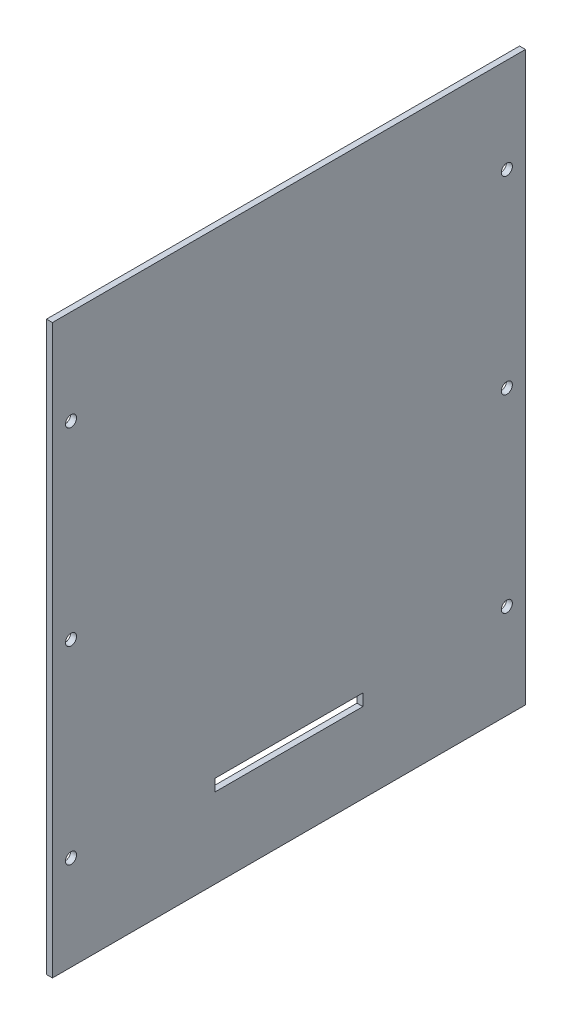
ISO-10303-21;
HEADER;
FILE_DESCRIPTION(('STEP AP214'),'2;1');
FILE_NAME('part.step','',(''),(''),'','','');
FILE_SCHEMA(('AUTOMOTIVE_DESIGN { 1 0 10303 214 1 1 1 1 }'));
ENDSEC;
DATA;
#1=APPLICATION_CONTEXT('core data for automotive mechanical design processes');
#2=APPLICATION_PROTOCOL_DEFINITION('international standard','automotive_design',2000,#1);
#3=PRODUCT_CONTEXT('',#1,'mechanical');
#4=PRODUCT('Part','Part','',(#3));
#5=PRODUCT_RELATED_PRODUCT_CATEGORY('part','',(#4));
#6=PRODUCT_DEFINITION_FORMATION('','',#4);
#7=PRODUCT_DEFINITION_CONTEXT('part definition',#1,'design');
#8=PRODUCT_DEFINITION('design','',#6,#7);
#9=PRODUCT_DEFINITION_SHAPE('','',#8);
#10=(LENGTH_UNIT() NAMED_UNIT(*) SI_UNIT(.MILLI.,.METRE.));
#11=(NAMED_UNIT(*) PLANE_ANGLE_UNIT() SI_UNIT($,.RADIAN.));
#12=(NAMED_UNIT(*) SI_UNIT($,.STERADIAN.) SOLID_ANGLE_UNIT());
#13=UNCERTAINTY_MEASURE_WITH_UNIT(LENGTH_MEASURE(1.E-05),#10,'distance_accuracy_value','');
#14=(GEOMETRIC_REPRESENTATION_CONTEXT(3) GLOBAL_UNCERTAINTY_ASSIGNED_CONTEXT((#13)) GLOBAL_UNIT_ASSIGNED_CONTEXT((#10,
#11,#12)) REPRESENTATION_CONTEXT('',''));
#15=CARTESIAN_POINT('',(0.,0.,0.));
#16=DIRECTION('',(0.,0.,1.));
#17=DIRECTION('',(1.,0.,0.));
#18=AXIS2_PLACEMENT_3D('',#15,#16,#17);
#19=CARTESIAN_POINT('',(1.5875,152.4,127.));
#20=DIRECTION('',(-1.,0.,0.));
#21=DIRECTION('',(0.,0.,1.));
#22=AXIS2_PLACEMENT_3D('',#19,#20,#21);
#23=PLANE('',#22);
#24=CARTESIAN_POINT('',(1.5875,101.6,-117.));
#25=DIRECTION('',(1.,0.,0.));
#26=DIRECTION('',(0.,0.,-1.));
#27=AXIS2_PLACEMENT_3D('',#24,#25,#26);
#28=CIRCLE('',#27,2.97688);
#29=CARTESIAN_POINT('',(1.5875,101.6,-119.97688));
#30=VERTEX_POINT('',#29);
#31=EDGE_CURVE('E249',#30,#30,#28,.T.);
#32=ORIENTED_EDGE('',*,*,#31,.F.);
#33=EDGE_LOOP('',(#32));
#34=FACE_BOUND('',#33,.T.);
#35=CARTESIAN_POINT('',(1.5875,-101.6,-117.));
#36=DIRECTION('',(1.,0.,0.));
#37=DIRECTION('',(0.,0.,1.));
#38=AXIS2_PLACEMENT_3D('',#35,#36,#37);
#39=CIRCLE('',#38,2.97688);
#40=CARTESIAN_POINT('',(1.5875,-101.6,-114.02312));
#41=VERTEX_POINT('',#40);
#42=EDGE_CURVE('E255',#41,#41,#39,.T.);
#43=ORIENTED_EDGE('',*,*,#42,.F.);
#44=EDGE_LOOP('',(#43));
#45=FACE_BOUND('',#44,.T.);
#46=CARTESIAN_POINT('',(1.5875,-101.600000000001,116.999999999999));
#47=DIRECTION('',(1.,0.,0.));
#48=DIRECTION('',(0.,0.,-1.));
#49=AXIS2_PLACEMENT_3D('',#46,#47,#48);
#50=CIRCLE('',#49,2.97688);
#51=CARTESIAN_POINT('',(1.5875,-101.600000000001,114.023119999999));
#52=VERTEX_POINT('',#51);
#53=EDGE_CURVE('E261',#52,#52,#50,.T.);
#54=ORIENTED_EDGE('',*,*,#53,.F.);
#55=EDGE_LOOP('',(#54));
#56=FACE_BOUND('',#55,.T.);
#57=CARTESIAN_POINT('',(1.5875,-8.32667268468867E-13,117.));
#58=DIRECTION('',(1.,0.,0.));
#59=DIRECTION('',(0.,0.,1.));
#60=AXIS2_PLACEMENT_3D('',#57,#58,#59);
#61=CIRCLE('',#60,2.97688);
#62=CARTESIAN_POINT('',(1.5875,-8.32667268468867E-13,119.97688));
#63=VERTEX_POINT('',#62);
#64=EDGE_CURVE('E243',#63,#63,#61,.T.);
#65=ORIENTED_EDGE('',*,*,#64,.F.);
#66=EDGE_LOOP('',(#65));
#67=FACE_BOUND('',#66,.T.);
#68=CARTESIAN_POINT('',(1.5875,101.599999999999,117.000000000001));
#69=DIRECTION('',(1.,0.,0.));
#70=DIRECTION('',(0.,0.,1.));
#71=AXIS2_PLACEMENT_3D('',#68,#69,#70);
#72=CIRCLE('',#71,2.97688);
#73=CARTESIAN_POINT('',(1.5875,101.599999999999,119.976880000001));
#74=VERTEX_POINT('',#73);
#75=EDGE_CURVE('E240',#74,#74,#72,.T.);
#76=ORIENTED_EDGE('',*,*,#75,.F.);
#77=EDGE_LOOP('',(#76));
#78=FACE_BOUND('',#77,.T.);
#79=CARTESIAN_POINT('',(1.5875,0.,-117.));
#80=DIRECTION('',(1.,0.,0.));
#81=DIRECTION('',(0.,0.,-1.));
#82=AXIS2_PLACEMENT_3D('',#79,#80,#81);
#83=CIRCLE('',#82,2.97688);
#84=CARTESIAN_POINT('',(1.5875,0.,-119.97688));
#85=VERTEX_POINT('',#84);
#86=EDGE_CURVE('E124',#85,#85,#83,.T.);
#87=ORIENTED_EDGE('',*,*,#86,.F.);
#88=EDGE_LOOP('',(#87));
#89=FACE_BOUND('',#88,.T.);
#90=DIRECTION('',(0.,0.,1.));
#91=VECTOR('',#90,1.);
#92=CARTESIAN_POINT('',(1.5875,-103.1875,39.6875));
#93=LINE('',#92,#91);
#94=CARTESIAN_POINT('',(1.5875,-103.1875,-39.6875));
#95=VERTEX_POINT('',#94);
#96=CARTESIAN_POINT('',(1.5875,-103.1875,39.6875));
#97=VERTEX_POINT('',#96);
#98=EDGE_CURVE('E130',#95,#97,#93,.T.);
#99=ORIENTED_EDGE('',*,*,#98,.F.);
#100=DIRECTION('',(0.,1.,0.));
#101=VECTOR('',#100,1.);
#102=CARTESIAN_POINT('',(1.5875,-109.5375,-39.6875));
#103=LINE('',#102,#101);
#104=CARTESIAN_POINT('',(1.5875,-109.5375,-39.6875));
#105=VERTEX_POINT('',#104);
#106=EDGE_CURVE('E50',#105,#95,#103,.T.);
#107=ORIENTED_EDGE('',*,*,#106,.F.);
#108=DIRECTION('',(0.,0.,-1.));
#109=VECTOR('',#108,1.);
#110=CARTESIAN_POINT('',(1.5875,-109.5375,39.6875));
#111=LINE('',#110,#109);
#112=CARTESIAN_POINT('',(1.5875,-109.5375,39.6875));
#113=VERTEX_POINT('',#112);
#114=EDGE_CURVE('E118',#113,#105,#111,.T.);
#115=ORIENTED_EDGE('',*,*,#114,.F.);
#116=DIRECTION('',(0.,-1.,0.));
#117=VECTOR('',#116,1.);
#118=CARTESIAN_POINT('',(1.5875,-109.5375,39.6875));
#119=LINE('',#118,#117);
#120=EDGE_CURVE('E121',#97,#113,#119,.T.);
#121=ORIENTED_EDGE('',*,*,#120,.F.);
#122=EDGE_LOOP('',(#99,#107,#115,#121));
#123=FACE_BOUND('',#122,.T.);
#124=DIRECTION('',(0.,0.,-1.));
#125=VECTOR('',#124,1.);
#126=CARTESIAN_POINT('',(1.5875,-152.4,127.));
#127=LINE('',#126,#125);
#128=CARTESIAN_POINT('',(1.5875,-152.4,127.));
#129=VERTEX_POINT('',#128);
#130=CARTESIAN_POINT('',(1.5875,-152.4,-127.));
#131=VERTEX_POINT('',#130);
#132=EDGE_CURVE('E137',#129,#131,#127,.T.);
#133=ORIENTED_EDGE('',*,*,#132,.T.);
#134=DIRECTION('',(0.,-1.,0.));
#135=VECTOR('',#134,1.);
#136=CARTESIAN_POINT('',(1.5875,152.4,-127.));
#137=LINE('',#136,#135);
#138=CARTESIAN_POINT('',(1.5875,152.4,-127.));
#139=VERTEX_POINT('',#138);
#140=EDGE_CURVE('E11',#139,#131,#137,.T.);
#141=ORIENTED_EDGE('',*,*,#140,.F.);
#142=DIRECTION('',(0.,0.,-1.));
#143=VECTOR('',#142,1.);
#144=CARTESIAN_POINT('',(1.5875,152.4,127.));
#145=LINE('',#144,#143);
#146=CARTESIAN_POINT('',(1.5875,152.4,127.));
#147=VERTEX_POINT('',#146);
#148=EDGE_CURVE('E141',#147,#139,#145,.T.);
#149=ORIENTED_EDGE('',*,*,#148,.F.);
#150=DIRECTION('',(0.,-1.,0.));
#151=VECTOR('',#150,1.);
#152=CARTESIAN_POINT('',(1.5875,152.4,127.));
#153=LINE('',#152,#151);
#154=EDGE_CURVE('E151',#147,#129,#153,.T.);
#155=ORIENTED_EDGE('',*,*,#154,.T.);
#156=EDGE_LOOP('',(#133,#141,#149,#155));
#157=FACE_BOUND('',#156,.T.);
#158=ADVANCED_FACE('F36',(#34,#45,#56,#67,#78,#89,#123,#157),#23,.F.);
#159=CARTESIAN_POINT('',(-1.5875,152.4,-127.));
#160=DIRECTION('',(0.,0.,1.));
#161=DIRECTION('',(1.,0.,0.));
#162=AXIS2_PLACEMENT_3D('',#159,#160,#161);
#163=PLANE('',#162);
#164=DIRECTION('',(-1.,0.,0.));
#165=VECTOR('',#164,1.);
#166=CARTESIAN_POINT('',(-1.5875,-152.4,-127.));
#167=LINE('',#166,#165);
#168=CARTESIAN_POINT('',(-1.5875,-152.4,-127.));
#169=VERTEX_POINT('',#168);
#170=EDGE_CURVE('E154',#131,#169,#167,.T.);
#171=ORIENTED_EDGE('',*,*,#170,.T.);
#172=DIRECTION('',(0.,-1.,0.));
#173=VECTOR('',#172,1.);
#174=CARTESIAN_POINT('',(-1.5875,152.4,-127.));
#175=LINE('',#174,#173);
#176=CARTESIAN_POINT('',(-1.5875,152.4,-127.));
#177=VERTEX_POINT('',#176);
#178=EDGE_CURVE('E43',#177,#169,#175,.T.);
#179=ORIENTED_EDGE('',*,*,#178,.F.);
#180=DIRECTION('',(-1.,0.,0.));
#181=VECTOR('',#180,1.);
#182=CARTESIAN_POINT('',(-1.5875,152.4,-127.));
#183=LINE('',#182,#181);
#184=EDGE_CURVE('E144',#139,#177,#183,.T.);
#185=ORIENTED_EDGE('',*,*,#184,.F.);
#186=ORIENTED_EDGE('',*,*,#140,.T.);
#187=EDGE_LOOP('',(#171,#179,#185,#186));
#188=FACE_BOUND('',#187,.T.);
#189=ADVANCED_FACE('F182',(#188),#163,.F.);
#190=CARTESIAN_POINT('',(-1.5875,152.4,127.));
#191=DIRECTION('',(1.,0.,0.));
#192=DIRECTION('',(0.,0.,-1.));
#193=AXIS2_PLACEMENT_3D('',#190,#191,#192);
#194=PLANE('',#193);
#195=CARTESIAN_POINT('',(-1.5875,101.6,-117.));
#196=DIRECTION('',(1.,0.,0.));
#197=DIRECTION('',(0.,0.,-1.));
#198=AXIS2_PLACEMENT_3D('',#195,#196,#197);
#199=CIRCLE('',#198,2.97688);
#200=CARTESIAN_POINT('',(-1.5875,101.6,-119.97688));
#201=VERTEX_POINT('',#200);
#202=EDGE_CURVE('E246',#201,#201,#199,.T.);
#203=ORIENTED_EDGE('',*,*,#202,.T.);
#204=EDGE_LOOP('',(#203));
#205=FACE_BOUND('',#204,.T.);
#206=CARTESIAN_POINT('',(-1.5875,-101.6,-117.));
#207=DIRECTION('',(1.,0.,0.));
#208=DIRECTION('',(0.,0.,1.));
#209=AXIS2_PLACEMENT_3D('',#206,#207,#208);
#210=CIRCLE('',#209,2.97688);
#211=CARTESIAN_POINT('',(-1.5875,-101.6,-114.02312));
#212=VERTEX_POINT('',#211);
#213=EDGE_CURVE('E252',#212,#212,#210,.T.);
#214=ORIENTED_EDGE('',*,*,#213,.T.);
#215=EDGE_LOOP('',(#214));
#216=FACE_BOUND('',#215,.T.);
#217=CARTESIAN_POINT('',(-1.5875,-101.600000000001,116.999999999999));
#218=DIRECTION('',(1.,0.,0.));
#219=DIRECTION('',(0.,0.,-1.));
#220=AXIS2_PLACEMENT_3D('',#217,#218,#219);
#221=CIRCLE('',#220,2.97688);
#222=CARTESIAN_POINT('',(-1.5875,-101.600000000001,114.023119999999));
#223=VERTEX_POINT('',#222);
#224=EDGE_CURVE('E258',#223,#223,#221,.T.);
#225=ORIENTED_EDGE('',*,*,#224,.T.);
#226=EDGE_LOOP('',(#225));
#227=FACE_BOUND('',#226,.T.);
#228=CARTESIAN_POINT('',(-1.5875,-8.32667268468867E-13,117.));
#229=DIRECTION('',(1.,0.,0.));
#230=DIRECTION('',(0.,0.,1.));
#231=AXIS2_PLACEMENT_3D('',#228,#229,#230);
#232=CIRCLE('',#231,2.97688);
#233=CARTESIAN_POINT('',(-1.5875,-8.32667268468867E-13,119.97688));
#234=VERTEX_POINT('',#233);
#235=EDGE_CURVE('E264',#234,#234,#232,.T.);
#236=ORIENTED_EDGE('',*,*,#235,.T.);
#237=EDGE_LOOP('',(#236));
#238=FACE_BOUND('',#237,.T.);
#239=CARTESIAN_POINT('',(-1.5875,101.599999999999,117.000000000001));
#240=DIRECTION('',(1.,0.,0.));
#241=DIRECTION('',(0.,0.,1.));
#242=AXIS2_PLACEMENT_3D('',#239,#240,#241);
#243=CIRCLE('',#242,2.97688);
#244=CARTESIAN_POINT('',(-1.5875,101.599999999999,119.976880000001));
#245=VERTEX_POINT('',#244);
#246=EDGE_CURVE('E237',#245,#245,#243,.T.);
#247=ORIENTED_EDGE('',*,*,#246,.T.);
#248=EDGE_LOOP('',(#247));
#249=FACE_BOUND('',#248,.T.);
#250=CARTESIAN_POINT('',(-1.5875,0.,-117.));
#251=DIRECTION('',(1.,0.,0.));
#252=DIRECTION('',(0.,0.,-1.));
#253=AXIS2_PLACEMENT_3D('',#250,#251,#252);
#254=CIRCLE('',#253,2.97688);
#255=CARTESIAN_POINT('',(-1.5875,0.,-119.97688));
#256=VERTEX_POINT('',#255);
#257=EDGE_CURVE('E131',#256,#256,#254,.T.);
#258=ORIENTED_EDGE('',*,*,#257,.T.);
#259=EDGE_LOOP('',(#258));
#260=FACE_BOUND('',#259,.T.);
#261=DIRECTION('',(0.,0.,-1.));
#262=VECTOR('',#261,1.);
#263=CARTESIAN_POINT('',(-1.5875,-109.5375,39.6875));
#264=LINE('',#263,#262);
#265=CARTESIAN_POINT('',(-1.5875,-109.5375,39.6875));
#266=VERTEX_POINT('',#265);
#267=CARTESIAN_POINT('',(-1.5875,-109.5375,-39.6875));
#268=VERTEX_POINT('',#267);
#269=EDGE_CURVE('E108',#266,#268,#264,.T.);
#270=ORIENTED_EDGE('',*,*,#269,.T.);
#271=DIRECTION('',(0.,1.,0.));
#272=VECTOR('',#271,1.);
#273=CARTESIAN_POINT('',(-1.5875,-109.5375,-39.6875));
#274=LINE('',#273,#272);
#275=CARTESIAN_POINT('',(-1.5875,-103.1875,-39.6875));
#276=VERTEX_POINT('',#275);
#277=EDGE_CURVE('E102',#268,#276,#274,.T.);
#278=ORIENTED_EDGE('',*,*,#277,.T.);
#279=DIRECTION('',(0.,0.,1.));
#280=VECTOR('',#279,1.);
#281=CARTESIAN_POINT('',(-1.5875,-103.1875,39.6875));
#282=LINE('',#281,#280);
#283=CARTESIAN_POINT('',(-1.5875,-103.1875,39.6875));
#284=VERTEX_POINT('',#283);
#285=EDGE_CURVE('E111',#276,#284,#282,.T.);
#286=ORIENTED_EDGE('',*,*,#285,.T.);
#287=DIRECTION('',(0.,-1.,0.));
#288=VECTOR('',#287,1.);
#289=CARTESIAN_POINT('',(-1.5875,-109.5375,39.6875));
#290=LINE('',#289,#288);
#291=EDGE_CURVE('E58',#284,#266,#290,.T.);
#292=ORIENTED_EDGE('',*,*,#291,.T.);
#293=EDGE_LOOP('',(#270,#278,#286,#292));
#294=FACE_BOUND('',#293,.T.);
#295=DIRECTION('',(0.,0.,1.));
#296=VECTOR('',#295,1.);
#297=CARTESIAN_POINT('',(-1.5875,-152.4,127.));
#298=LINE('',#297,#296);
#299=CARTESIAN_POINT('',(-1.5875,-152.4,127.));
#300=VERTEX_POINT('',#299);
#301=EDGE_CURVE('E156',#169,#300,#298,.T.);
#302=ORIENTED_EDGE('',*,*,#301,.T.);
#303=DIRECTION('',(0.,-1.,0.));
#304=VECTOR('',#303,1.);
#305=CARTESIAN_POINT('',(-1.5875,152.4,127.));
#306=LINE('',#305,#304);
#307=CARTESIAN_POINT('',(-1.5875,152.4,127.));
#308=VERTEX_POINT('',#307);
#309=EDGE_CURVE('E161',#308,#300,#306,.T.);
#310=ORIENTED_EDGE('',*,*,#309,.F.);
#311=DIRECTION('',(0.,0.,1.));
#312=VECTOR('',#311,1.);
#313=CARTESIAN_POINT('',(-1.5875,152.4,127.));
#314=LINE('',#313,#312);
#315=EDGE_CURVE('E147',#177,#308,#314,.T.);
#316=ORIENTED_EDGE('',*,*,#315,.F.);
#317=ORIENTED_EDGE('',*,*,#178,.T.);
#318=EDGE_LOOP('',(#302,#310,#316,#317));
#319=FACE_BOUND('',#318,.T.);
#320=ADVANCED_FACE('F115',(#205,#216,#227,#238,#249,#260,#294,#319),#194,.F.);
#321=CARTESIAN_POINT('',(-1.5875,152.4,127.));
#322=DIRECTION('',(0.,0.,-1.));
#323=DIRECTION('',(-1.,0.,0.));
#324=AXIS2_PLACEMENT_3D('',#321,#322,#323);
#325=PLANE('',#324);
#326=DIRECTION('',(1.,0.,0.));
#327=VECTOR('',#326,1.);
#328=CARTESIAN_POINT('',(-1.5875,-152.4,127.));
#329=LINE('',#328,#327);
#330=EDGE_CURVE('E145',#300,#129,#329,.T.);
#331=ORIENTED_EDGE('',*,*,#330,.T.);
#332=ORIENTED_EDGE('',*,*,#154,.F.);
#333=DIRECTION('',(1.,0.,0.));
#334=VECTOR('',#333,1.);
#335=CARTESIAN_POINT('',(-1.5875,152.4,127.));
#336=LINE('',#335,#334);
#337=EDGE_CURVE('E149',#308,#147,#336,.T.);
#338=ORIENTED_EDGE('',*,*,#337,.F.);
#339=ORIENTED_EDGE('',*,*,#309,.T.);
#340=EDGE_LOOP('',(#331,#332,#338,#339));
#341=FACE_BOUND('',#340,.T.);
#342=ADVANCED_FACE('F175',(#341),#325,.F.);
#343=CARTESIAN_POINT('',(0.,152.4,0.));
#344=DIRECTION('',(0.,-1.,0.));
#345=DIRECTION('',(0.,0.,-1.));
#346=AXIS2_PLACEMENT_3D('',#343,#344,#345);
#347=PLANE('',#346);
#348=ORIENTED_EDGE('',*,*,#148,.T.);
#349=ORIENTED_EDGE('',*,*,#184,.T.);
#350=ORIENTED_EDGE('',*,*,#315,.T.);
#351=ORIENTED_EDGE('',*,*,#337,.T.);
#352=EDGE_LOOP('',(#348,#349,#350,#351));
#353=FACE_BOUND('',#352,.T.);
#354=ADVANCED_FACE('F181',(#353),#347,.F.);
#355=CARTESIAN_POINT('',(0.,-152.4,0.));
#356=DIRECTION('',(0.,-1.,0.));
#357=DIRECTION('',(0.,0.,-1.));
#358=AXIS2_PLACEMENT_3D('',#355,#356,#357);
#359=PLANE('',#358);
#360=ORIENTED_EDGE('',*,*,#132,.F.);
#361=ORIENTED_EDGE('',*,*,#330,.F.);
#362=ORIENTED_EDGE('',*,*,#301,.F.);
#363=ORIENTED_EDGE('',*,*,#170,.F.);
#364=EDGE_LOOP('',(#360,#361,#362,#363));
#365=FACE_BOUND('',#364,.T.);
#366=ADVANCED_FACE('F172',(#365),#359,.T.);
#367=CARTESIAN_POINT('',(-1.5875,-109.5375,-39.6875));
#368=DIRECTION('',(0.,0.,-1.));
#369=DIRECTION('',(-1.,0.,0.));
#370=AXIS2_PLACEMENT_3D('',#367,#368,#369);
#371=PLANE('',#370);
#372=ORIENTED_EDGE('',*,*,#106,.T.);
#373=DIRECTION('',(1.,0.,0.));
#374=VECTOR('',#373,1.);
#375=CARTESIAN_POINT('',(-1.5875,-103.1875,-39.6875));
#376=LINE('',#375,#374);
#377=EDGE_CURVE('E98',#276,#95,#376,.T.);
#378=ORIENTED_EDGE('',*,*,#377,.F.);
#379=ORIENTED_EDGE('',*,*,#277,.F.);
#380=DIRECTION('',(1.,0.,0.));
#381=VECTOR('',#380,1.);
#382=CARTESIAN_POINT('',(-1.5875,-109.5375,-39.6875));
#383=LINE('',#382,#381);
#384=EDGE_CURVE('E135',#268,#105,#383,.T.);
#385=ORIENTED_EDGE('',*,*,#384,.T.);
#386=EDGE_LOOP('',(#372,#378,#379,#385));
#387=FACE_BOUND('',#386,.T.);
#388=ADVANCED_FACE('F100',(#387),#371,.F.);
#389=CARTESIAN_POINT('',(-1.5875,-109.5375,39.6875));
#390=DIRECTION('',(0.,-1.,0.));
#391=DIRECTION('',(0.,0.,-1.));
#392=AXIS2_PLACEMENT_3D('',#389,#390,#391);
#393=PLANE('',#392);
#394=ORIENTED_EDGE('',*,*,#114,.T.);
#395=ORIENTED_EDGE('',*,*,#384,.F.);
#396=ORIENTED_EDGE('',*,*,#269,.F.);
#397=DIRECTION('',(1.,0.,0.));
#398=VECTOR('',#397,1.);
#399=CARTESIAN_POINT('',(-1.5875,-109.5375,39.6875));
#400=LINE('',#399,#398);
#401=EDGE_CURVE('E138',#266,#113,#400,.T.);
#402=ORIENTED_EDGE('',*,*,#401,.T.);
#403=EDGE_LOOP('',(#394,#395,#396,#402));
#404=FACE_BOUND('',#403,.T.);
#405=ADVANCED_FACE('F200',(#404),#393,.F.);
#406=CARTESIAN_POINT('',(-1.5875,-109.5375,39.6875));
#407=DIRECTION('',(0.,0.,1.));
#408=DIRECTION('',(1.,0.,0.));
#409=AXIS2_PLACEMENT_3D('',#406,#407,#408);
#410=PLANE('',#409);
#411=ORIENTED_EDGE('',*,*,#120,.T.);
#412=ORIENTED_EDGE('',*,*,#401,.F.);
#413=ORIENTED_EDGE('',*,*,#291,.F.);
#414=DIRECTION('',(1.,0.,0.));
#415=VECTOR('',#414,1.);
#416=CARTESIAN_POINT('',(-1.5875,-103.1875,39.6875));
#417=LINE('',#416,#415);
#418=EDGE_CURVE('E107',#284,#97,#417,.T.);
#419=ORIENTED_EDGE('',*,*,#418,.T.);
#420=EDGE_LOOP('',(#411,#412,#413,#419));
#421=FACE_BOUND('',#420,.T.);
#422=ADVANCED_FACE('F204',(#421),#410,.F.);
#423=CARTESIAN_POINT('',(-1.5875,-103.1875,39.6875));
#424=DIRECTION('',(0.,1.,0.));
#425=DIRECTION('',(0.,0.,1.));
#426=AXIS2_PLACEMENT_3D('',#423,#424,#425);
#427=PLANE('',#426);
#428=ORIENTED_EDGE('',*,*,#98,.T.);
#429=ORIENTED_EDGE('',*,*,#418,.F.);
#430=ORIENTED_EDGE('',*,*,#285,.F.);
#431=ORIENTED_EDGE('',*,*,#377,.T.);
#432=EDGE_LOOP('',(#428,#429,#430,#431));
#433=FACE_BOUND('',#432,.T.);
#434=ADVANCED_FACE('F112',(#433),#427,.F.);
#435=CARTESIAN_POINT('',(-1.5875,0.,-117.));
#436=DIRECTION('',(1.,0.,0.));
#437=DIRECTION('',(0.,0.,-1.));
#438=AXIS2_PLACEMENT_3D('',#435,#436,#437);
#439=CYLINDRICAL_SURFACE('',#438,2.97688);
#440=ORIENTED_EDGE('',*,*,#257,.F.);
#441=EDGE_LOOP('',(#440));
#442=FACE_BOUND('',#441,.T.);
#443=ORIENTED_EDGE('',*,*,#86,.T.);
#444=EDGE_LOOP('',(#443));
#445=FACE_BOUND('',#444,.T.);
#446=ADVANCED_FACE('F203',(#442,#445),#439,.F.);
#447=CARTESIAN_POINT('',(-1.5875,101.599999999999,117.000000000001));
#448=DIRECTION('',(1.,0.,0.));
#449=DIRECTION('',(0.,0.,-1.));
#450=AXIS2_PLACEMENT_3D('',#447,#448,#449);
#451=CYLINDRICAL_SURFACE('',#450,2.97688);
#452=ORIENTED_EDGE('',*,*,#246,.F.);
#453=EDGE_LOOP('',(#452));
#454=FACE_BOUND('',#453,.T.);
#455=ORIENTED_EDGE('',*,*,#75,.T.);
#456=EDGE_LOOP('',(#455));
#457=FACE_BOUND('',#456,.T.);
#458=ADVANCED_FACE('F212',(#454,#457),#451,.F.);
#459=CARTESIAN_POINT('',(-1.5875,-8.32667268468867E-13,117.));
#460=DIRECTION('',(1.,0.,0.));
#461=DIRECTION('',(0.,0.,-1.));
#462=AXIS2_PLACEMENT_3D('',#459,#460,#461);
#463=CYLINDRICAL_SURFACE('',#462,2.97688);
#464=ORIENTED_EDGE('',*,*,#235,.F.);
#465=EDGE_LOOP('',(#464));
#466=FACE_BOUND('',#465,.T.);
#467=ORIENTED_EDGE('',*,*,#64,.T.);
#468=EDGE_LOOP('',(#467));
#469=FACE_BOUND('',#468,.T.);
#470=ADVANCED_FACE('F214',(#466,#469),#463,.F.);
#471=CARTESIAN_POINT('',(-1.5875,-101.600000000001,116.999999999999));
#472=DIRECTION('',(1.,0.,0.));
#473=DIRECTION('',(0.,0.,-1.));
#474=AXIS2_PLACEMENT_3D('',#471,#472,#473);
#475=CYLINDRICAL_SURFACE('',#474,2.97688);
#476=ORIENTED_EDGE('',*,*,#224,.F.);
#477=EDGE_LOOP('',(#476));
#478=FACE_BOUND('',#477,.T.);
#479=ORIENTED_EDGE('',*,*,#53,.T.);
#480=EDGE_LOOP('',(#479));
#481=FACE_BOUND('',#480,.T.);
#482=ADVANCED_FACE('F217',(#478,#481),#475,.F.);
#483=CARTESIAN_POINT('',(-1.5875,-101.6,-117.));
#484=DIRECTION('',(1.,0.,0.));
#485=DIRECTION('',(0.,0.,-1.));
#486=AXIS2_PLACEMENT_3D('',#483,#484,#485);
#487=CYLINDRICAL_SURFACE('',#486,2.97688);
#488=ORIENTED_EDGE('',*,*,#213,.F.);
#489=EDGE_LOOP('',(#488));
#490=FACE_BOUND('',#489,.T.);
#491=ORIENTED_EDGE('',*,*,#42,.T.);
#492=EDGE_LOOP('',(#491));
#493=FACE_BOUND('',#492,.T.);
#494=ADVANCED_FACE('F221',(#490,#493),#487,.F.);
#495=CARTESIAN_POINT('',(-1.5875,101.6,-117.));
#496=DIRECTION('',(1.,0.,0.));
#497=DIRECTION('',(0.,0.,-1.));
#498=AXIS2_PLACEMENT_3D('',#495,#496,#497);
#499=CYLINDRICAL_SURFACE('',#498,2.97688);
#500=ORIENTED_EDGE('',*,*,#202,.F.);
#501=EDGE_LOOP('',(#500));
#502=FACE_BOUND('',#501,.T.);
#503=ORIENTED_EDGE('',*,*,#31,.T.);
#504=EDGE_LOOP('',(#503));
#505=FACE_BOUND('',#504,.T.);
#506=ADVANCED_FACE('F225',(#502,#505),#499,.F.);
#507=CLOSED_SHELL('',(#158,#189,#320,#342,#354,#366,#388,#405,#422,#434,#446,#458,#470,#482,
#494,#506));
#508=MANIFOLD_SOLID_BREP('B2',#507);
#509=ADVANCED_BREP_SHAPE_REPRESENTATION('',(#18,#508),#14);
#510=SHAPE_DEFINITION_REPRESENTATION(#9,#509);
ENDSEC;
END-ISO-10303-21;
